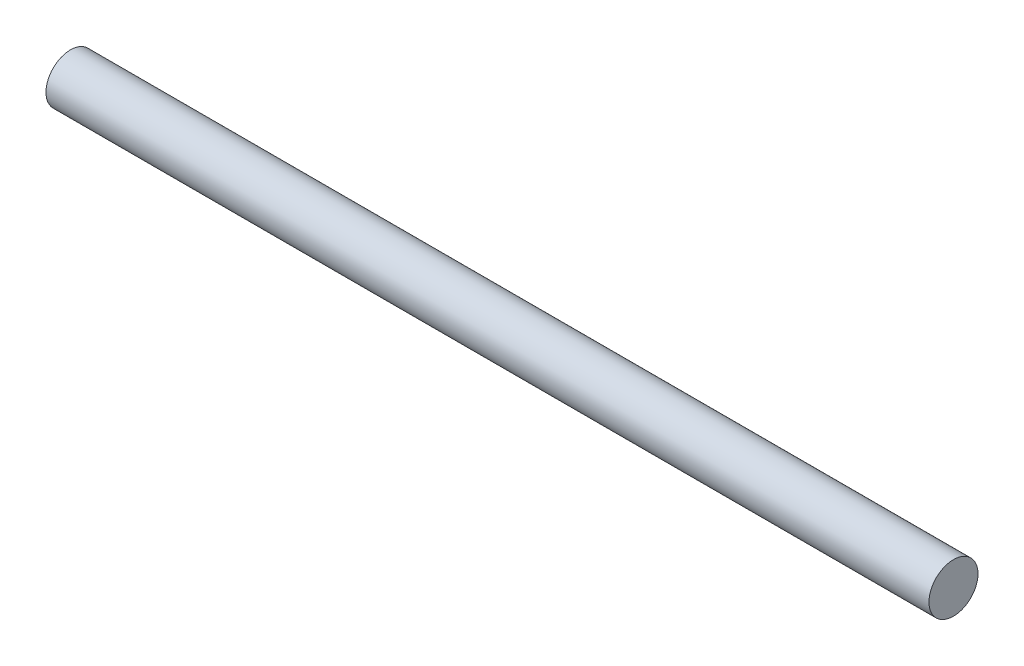
ISO-10303-21;
HEADER;
FILE_DESCRIPTION(('STEP AP214'),'2;1');
FILE_NAME('part.step','',(''),(''),'','','');
FILE_SCHEMA(('AUTOMOTIVE_DESIGN { 1 0 10303 214 1 1 1 1 }'));
ENDSEC;
DATA;
#1=APPLICATION_CONTEXT('core data for automotive mechanical design processes');
#2=APPLICATION_PROTOCOL_DEFINITION('international standard','automotive_design',2000,#1);
#3=PRODUCT_CONTEXT('',#1,'mechanical');
#4=PRODUCT('Part','Part','',(#3));
#5=PRODUCT_RELATED_PRODUCT_CATEGORY('part','',(#4));
#6=PRODUCT_DEFINITION_FORMATION('','',#4);
#7=PRODUCT_DEFINITION_CONTEXT('part definition',#1,'design');
#8=PRODUCT_DEFINITION('design','',#6,#7);
#9=PRODUCT_DEFINITION_SHAPE('','',#8);
#10=(LENGTH_UNIT() NAMED_UNIT(*) SI_UNIT(.MILLI.,.METRE.));
#11=(NAMED_UNIT(*) PLANE_ANGLE_UNIT() SI_UNIT($,.RADIAN.));
#12=(NAMED_UNIT(*) SI_UNIT($,.STERADIAN.) SOLID_ANGLE_UNIT());
#13=UNCERTAINTY_MEASURE_WITH_UNIT(LENGTH_MEASURE(1.E-05),#10,'distance_accuracy_value','');
#14=(GEOMETRIC_REPRESENTATION_CONTEXT(3) GLOBAL_UNCERTAINTY_ASSIGNED_CONTEXT((#13)) GLOBAL_UNIT_ASSIGNED_CONTEXT((#10,
#11,#12)) REPRESENTATION_CONTEXT('',''));
#15=CARTESIAN_POINT('',(0.,0.,0.));
#16=DIRECTION('',(0.,0.,1.));
#17=DIRECTION('',(1.,0.,0.));
#18=AXIS2_PLACEMENT_3D('',#15,#16,#17);
#19=CARTESIAN_POINT('',(270.,0.,0.));
#20=DIRECTION('',(-1.,0.,0.));
#21=DIRECTION('',(0.,0.,1.));
#22=AXIS2_PLACEMENT_3D('',#19,#20,#21);
#23=CYLINDRICAL_SURFACE('',#22,7.5);
#24=CARTESIAN_POINT('',(270.,0.,0.));
#25=DIRECTION('',(1.,0.,0.));
#26=DIRECTION('',(0.,0.,-1.));
#27=AXIS2_PLACEMENT_3D('',#24,#25,#26);
#28=CIRCLE('',#27,7.5);
#29=CARTESIAN_POINT('',(270.,0.,-7.5));
#30=VERTEX_POINT('',#29);
#31=EDGE_CURVE('E10',#30,#30,#28,.T.);
#32=ORIENTED_EDGE('',*,*,#31,.F.);
#33=EDGE_LOOP('',(#32));
#34=FACE_BOUND('',#33,.T.);
#35=CARTESIAN_POINT('',(0.,0.,0.));
#36=DIRECTION('',(1.,0.,0.));
#37=DIRECTION('',(0.,0.,-1.));
#38=AXIS2_PLACEMENT_3D('',#35,#36,#37);
#39=CIRCLE('',#38,7.5);
#40=CARTESIAN_POINT('',(0.,0.,-7.5));
#41=VERTEX_POINT('',#40);
#42=EDGE_CURVE('E44',#41,#41,#39,.T.);
#43=ORIENTED_EDGE('',*,*,#42,.T.);
#44=EDGE_LOOP('',(#43));
#45=FACE_BOUND('',#44,.T.);
#46=ADVANCED_FACE('F41',(#34,#45),#23,.T.);
#47=CARTESIAN_POINT('',(270.,0.,0.));
#48=DIRECTION('',(1.,0.,0.));
#49=DIRECTION('',(0.,0.,-1.));
#50=AXIS2_PLACEMENT_3D('',#47,#48,#49);
#51=PLANE('',#50);
#52=ORIENTED_EDGE('',*,*,#31,.T.);
#53=EDGE_LOOP('',(#52));
#54=FACE_BOUND('',#53,.T.);
#55=ADVANCED_FACE('F58',(#54),#51,.T.);
#56=CARTESIAN_POINT('',(0.,0.,0.));
#57=DIRECTION('',(1.,0.,0.));
#58=DIRECTION('',(0.,0.,-1.));
#59=AXIS2_PLACEMENT_3D('',#56,#57,#58);
#60=PLANE('',#59);
#61=ORIENTED_EDGE('',*,*,#42,.F.);
#62=EDGE_LOOP('',(#61));
#63=FACE_BOUND('',#62,.T.);
#64=ADVANCED_FACE('F56',(#63),#60,.F.);
#65=CLOSED_SHELL('',(#46,#55,#64));
#66=MANIFOLD_SOLID_BREP('B2',#65);
#67=ADVANCED_BREP_SHAPE_REPRESENTATION('',(#18,#66),#14);
#68=SHAPE_DEFINITION_REPRESENTATION(#9,#67);
ENDSEC;
END-ISO-10303-21;
